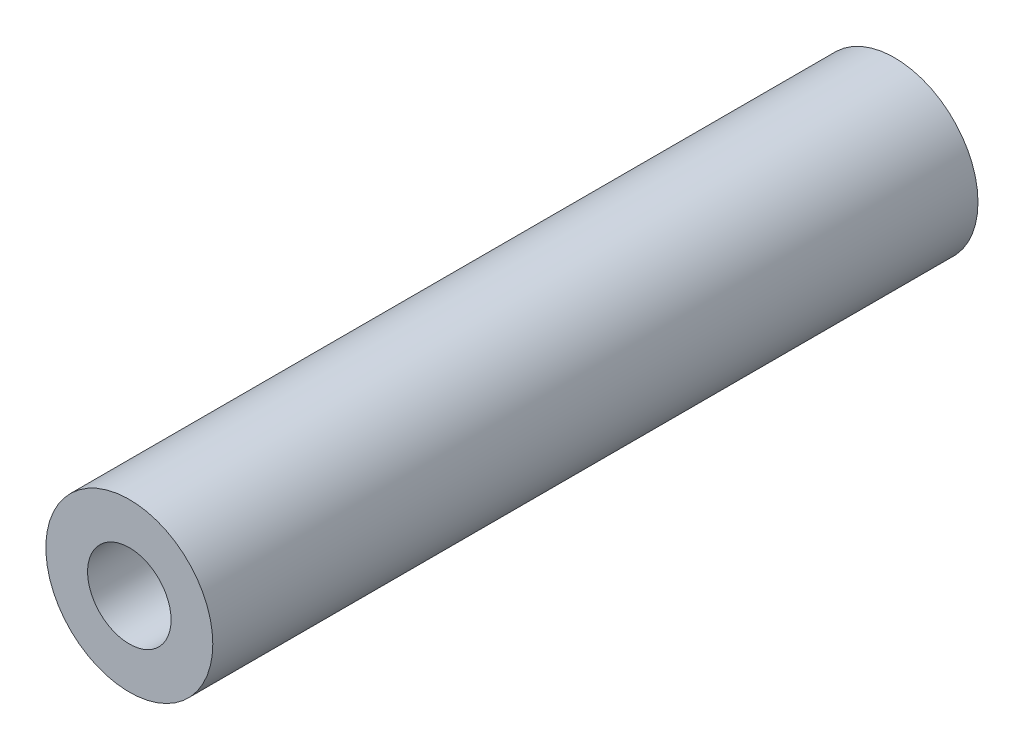
ISO-10303-21;
HEADER;
FILE_DESCRIPTION(('STEP AP214'),'2;1');
FILE_NAME('part.step','',(''),(''),'','','');
FILE_SCHEMA(('AUTOMOTIVE_DESIGN { 1 0 10303 214 1 1 1 1 }'));
ENDSEC;
DATA;
#1=APPLICATION_CONTEXT('core data for automotive mechanical design processes');
#2=APPLICATION_PROTOCOL_DEFINITION('international standard','automotive_design',2000,#1);
#3=PRODUCT_CONTEXT('',#1,'mechanical');
#4=PRODUCT('Part','Part','',(#3));
#5=PRODUCT_RELATED_PRODUCT_CATEGORY('part','',(#4));
#6=PRODUCT_DEFINITION_FORMATION('','',#4);
#7=PRODUCT_DEFINITION_CONTEXT('part definition',#1,'design');
#8=PRODUCT_DEFINITION('design','',#6,#7);
#9=PRODUCT_DEFINITION_SHAPE('','',#8);
#10=(LENGTH_UNIT() NAMED_UNIT(*) SI_UNIT(.MILLI.,.METRE.));
#11=(NAMED_UNIT(*) PLANE_ANGLE_UNIT() SI_UNIT($,.RADIAN.));
#12=(NAMED_UNIT(*) SI_UNIT($,.STERADIAN.) SOLID_ANGLE_UNIT());
#13=UNCERTAINTY_MEASURE_WITH_UNIT(LENGTH_MEASURE(1.E-05),#10,'distance_accuracy_value','');
#14=(GEOMETRIC_REPRESENTATION_CONTEXT(3) GLOBAL_UNCERTAINTY_ASSIGNED_CONTEXT((#13)) GLOBAL_UNIT_ASSIGNED_CONTEXT((#10,
#11,#12)) REPRESENTATION_CONTEXT('',''));
#15=CARTESIAN_POINT('',(0.,0.,0.));
#16=DIRECTION('',(0.,0.,1.));
#17=DIRECTION('',(1.,0.,0.));
#18=AXIS2_PLACEMENT_3D('',#15,#16,#17);
#19=CARTESIAN_POINT('',(0.,0.,55.));
#20=DIRECTION('',(0.,0.,1.));
#21=DIRECTION('',(1.,0.,0.));
#22=AXIS2_PLACEMENT_3D('',#19,#20,#21);
#23=PLANE('',#22);
#24=CARTESIAN_POINT('',(0.,0.,55.));
#25=DIRECTION('',(0.,0.,1.));
#26=DIRECTION('',(1.,0.,0.));
#27=AXIS2_PLACEMENT_3D('',#24,#25,#26);
#28=CIRCLE('',#27,6.);
#29=CARTESIAN_POINT('',(6.,0.,55.));
#30=VERTEX_POINT('',#29);
#31=EDGE_CURVE('E10',#30,#30,#28,.T.);
#32=ORIENTED_EDGE('',*,*,#31,.T.);
#33=EDGE_LOOP('',(#32));
#34=FACE_BOUND('',#33,.T.);
#35=CARTESIAN_POINT('',(0.,0.,55.));
#36=DIRECTION('',(0.,0.,1.));
#37=DIRECTION('',(1.,0.,0.));
#38=AXIS2_PLACEMENT_3D('',#35,#36,#37);
#39=CIRCLE('',#38,3.);
#40=CARTESIAN_POINT('',(3.,0.,55.));
#41=VERTEX_POINT('',#40);
#42=EDGE_CURVE('E50',#41,#41,#39,.T.);
#43=ORIENTED_EDGE('',*,*,#42,.F.);
#44=EDGE_LOOP('',(#43));
#45=FACE_BOUND('',#44,.T.);
#46=ADVANCED_FACE('F37',(#34,#45),#23,.T.);
#47=CARTESIAN_POINT('',(0.,0.,0.));
#48=DIRECTION('',(0.,0.,1.));
#49=DIRECTION('',(1.,0.,0.));
#50=AXIS2_PLACEMENT_3D('',#47,#48,#49);
#51=PLANE('',#50);
#52=CARTESIAN_POINT('',(0.,0.,0.));
#53=DIRECTION('',(0.,0.,1.));
#54=DIRECTION('',(1.,0.,0.));
#55=AXIS2_PLACEMENT_3D('',#52,#53,#54);
#56=CIRCLE('',#55,6.);
#57=CARTESIAN_POINT('',(6.,0.,0.));
#58=VERTEX_POINT('',#57);
#59=EDGE_CURVE('E41',#58,#58,#56,.T.);
#60=ORIENTED_EDGE('',*,*,#59,.F.);
#61=EDGE_LOOP('',(#60));
#62=FACE_BOUND('',#61,.T.);
#63=CARTESIAN_POINT('',(0.,0.,0.));
#64=DIRECTION('',(0.,0.,1.));
#65=DIRECTION('',(1.,0.,0.));
#66=AXIS2_PLACEMENT_3D('',#63,#64,#65);
#67=CIRCLE('',#66,3.);
#68=CARTESIAN_POINT('',(3.,0.,0.));
#69=VERTEX_POINT('',#68);
#70=EDGE_CURVE('E52',#69,#69,#67,.T.);
#71=ORIENTED_EDGE('',*,*,#70,.T.);
#72=EDGE_LOOP('',(#71));
#73=FACE_BOUND('',#72,.T.);
#74=ADVANCED_FACE('F64',(#62,#73),#51,.F.);
#75=CARTESIAN_POINT('',(0.,0.,55.));
#76=DIRECTION('',(0.,0.,-1.));
#77=DIRECTION('',(-1.,0.,0.));
#78=AXIS2_PLACEMENT_3D('',#75,#76,#77);
#79=CYLINDRICAL_SURFACE('',#78,6.);
#80=ORIENTED_EDGE('',*,*,#31,.F.);
#81=EDGE_LOOP('',(#80));
#82=FACE_BOUND('',#81,.T.);
#83=ORIENTED_EDGE('',*,*,#59,.T.);
#84=EDGE_LOOP('',(#83));
#85=FACE_BOUND('',#84,.T.);
#86=ADVANCED_FACE('F39',(#82,#85),#79,.T.);
#87=CARTESIAN_POINT('',(0.,0.,55.));
#88=DIRECTION('',(0.,0.,-1.));
#89=DIRECTION('',(-1.,0.,0.));
#90=AXIS2_PLACEMENT_3D('',#87,#88,#89);
#91=CYLINDRICAL_SURFACE('',#90,3.);
#92=ORIENTED_EDGE('',*,*,#42,.T.);
#93=EDGE_LOOP('',(#92));
#94=FACE_BOUND('',#93,.T.);
#95=ORIENTED_EDGE('',*,*,#70,.F.);
#96=EDGE_LOOP('',(#95));
#97=FACE_BOUND('',#96,.T.);
#98=ADVANCED_FACE('F60',(#94,#97),#91,.F.);
#99=CLOSED_SHELL('',(#46,#74,#86,#98));
#100=MANIFOLD_SOLID_BREP('B2',#99);
#101=ADVANCED_BREP_SHAPE_REPRESENTATION('',(#18,#100),#14);
#102=SHAPE_DEFINITION_REPRESENTATION(#9,#101);
ENDSEC;
END-ISO-10303-21;
